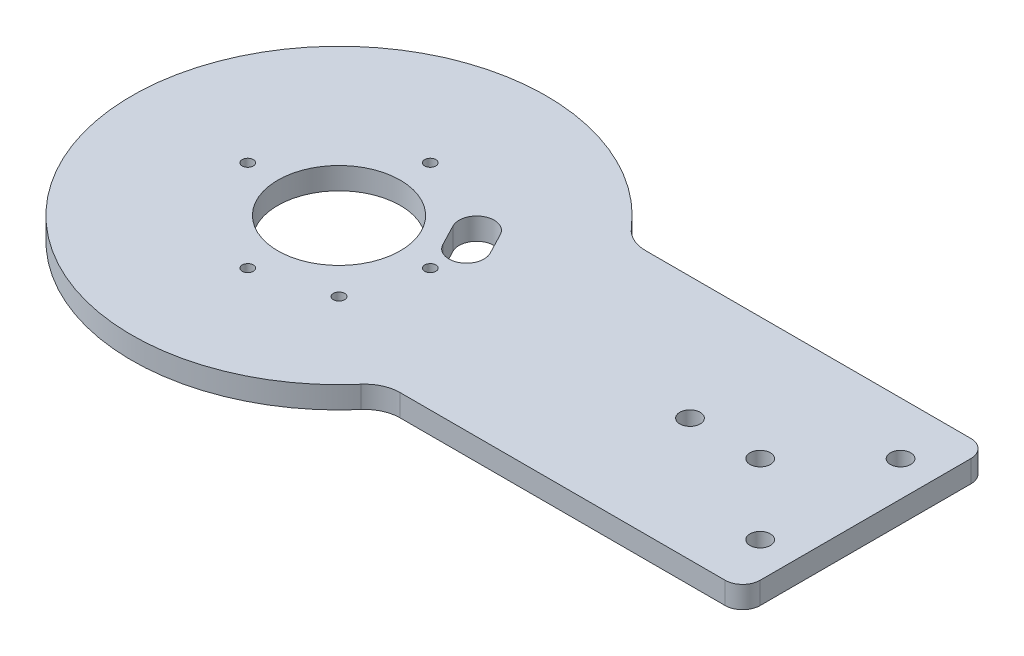
ISO-10303-21;
HEADER;
FILE_DESCRIPTION(('STEP AP214'),'2;1');
FILE_NAME('part.step','',(''),(''),'','','');
FILE_SCHEMA(('AUTOMOTIVE_DESIGN { 1 0 10303 214 1 1 1 1 }'));
ENDSEC;
DATA;
#1=APPLICATION_CONTEXT('core data for automotive mechanical design processes');
#2=APPLICATION_PROTOCOL_DEFINITION('international standard','automotive_design',2000,#1);
#3=PRODUCT_CONTEXT('',#1,'mechanical');
#4=PRODUCT('Part','Part','',(#3));
#5=PRODUCT_RELATED_PRODUCT_CATEGORY('part','',(#4));
#6=PRODUCT_DEFINITION_FORMATION('','',#4);
#7=PRODUCT_DEFINITION_CONTEXT('part definition',#1,'design');
#8=PRODUCT_DEFINITION('design','',#6,#7);
#9=PRODUCT_DEFINITION_SHAPE('','',#8);
#10=(LENGTH_UNIT() NAMED_UNIT(*) SI_UNIT(.MILLI.,.METRE.));
#11=(NAMED_UNIT(*) PLANE_ANGLE_UNIT() SI_UNIT($,.RADIAN.));
#12=(NAMED_UNIT(*) SI_UNIT($,.STERADIAN.) SOLID_ANGLE_UNIT());
#13=UNCERTAINTY_MEASURE_WITH_UNIT(LENGTH_MEASURE(1.E-05),#10,'distance_accuracy_value','');
#14=(GEOMETRIC_REPRESENTATION_CONTEXT(3) GLOBAL_UNCERTAINTY_ASSIGNED_CONTEXT((#13)) GLOBAL_UNIT_ASSIGNED_CONTEXT((#10,
#11,#12)) REPRESENTATION_CONTEXT('',''));
#15=CARTESIAN_POINT('',(0.,0.,0.));
#16=DIRECTION('',(0.,0.,1.));
#17=DIRECTION('',(1.,0.,0.));
#18=AXIS2_PLACEMENT_3D('',#15,#16,#17);
#19=CARTESIAN_POINT('',(0.,7.9375,0.));
#20=DIRECTION('',(0.,-1.,0.));
#21=DIRECTION('',(0.,0.,-1.));
#22=AXIS2_PLACEMENT_3D('',#19,#20,#21);
#23=CYLINDRICAL_SURFACE('',#22,75.00112);
#24=CARTESIAN_POINT('',(0.,7.9375,0.));
#25=DIRECTION('',(0.,1.,0.));
#26=DIRECTION('',(0.,0.,1.));
#27=AXIS2_PLACEMENT_3D('',#24,#25,#26);
#28=CIRCLE('',#27,75.00112);
#29=CARTESIAN_POINT('',(56.8901535536481,7.9375,-48.8741079703429));
#30=VERTEX_POINT('',#29);
#31=CARTESIAN_POINT('',(56.8901535536481,7.9375,48.8741079703429));
#32=VERTEX_POINT('',#31);
#33=EDGE_CURVE('E196',#30,#32,#28,.T.);
#34=ORIENTED_EDGE('',*,*,#33,.F.);
#35=DIRECTION('',(0.,-1.,0.));
#36=VECTOR('',#35,1.);
#37=CARTESIAN_POINT('',(56.8901535536481,7.9375,-48.8741079703429));
#38=LINE('',#37,#36);
#39=CARTESIAN_POINT('',(56.8901535536481,0.,-48.8741079703429));
#40=VERTEX_POINT('',#39);
#41=EDGE_CURVE('E238',#30,#40,#38,.T.);
#42=ORIENTED_EDGE('',*,*,#41,.T.);
#43=CARTESIAN_POINT('',(0.,0.,0.));
#44=DIRECTION('',(0.,1.,0.));
#45=DIRECTION('',(0.,0.,1.));
#46=AXIS2_PLACEMENT_3D('',#43,#44,#45);
#47=CIRCLE('',#46,75.00112);
#48=CARTESIAN_POINT('',(56.8901535536481,0.,48.8741079703429));
#49=VERTEX_POINT('',#48);
#50=EDGE_CURVE('E193',#40,#49,#47,.T.);
#51=ORIENTED_EDGE('',*,*,#50,.T.);
#52=DIRECTION('',(0.,-1.,0.));
#53=VECTOR('',#52,1.);
#54=CARTESIAN_POINT('',(56.8901535536481,7.9375,48.8741079703429));
#55=LINE('',#54,#53);
#56=EDGE_CURVE('E236',#49,#32,#55,.F.);
#57=ORIENTED_EDGE('',*,*,#56,.T.);
#58=EDGE_LOOP('',(#34,#42,#51,#57));
#59=FACE_BOUND('',#58,.T.);
#60=ADVANCED_FACE('F35',(#59),#23,.T.);
#61=CARTESIAN_POINT('',(190.5,7.9375,44.45));
#62=DIRECTION('',(0.,0.,-1.));
#63=DIRECTION('',(-1.,0.,0.));
#64=AXIS2_PLACEMENT_3D('',#61,#62,#63);
#65=PLANE('',#64);
#66=DIRECTION('',(1.,0.,0.));
#67=VECTOR('',#66,1.);
#68=CARTESIAN_POINT('',(190.5,7.9375,44.45));
#69=LINE('',#68,#67);
#70=CARTESIAN_POINT('',(66.5234090321174,7.9375,44.45));
#71=VERTEX_POINT('',#70);
#72=CARTESIAN_POINT('',(184.15,7.9375,44.45));
#73=VERTEX_POINT('',#72);
#74=EDGE_CURVE('E198',#71,#73,#69,.T.);
#75=ORIENTED_EDGE('',*,*,#74,.F.);
#76=DIRECTION('',(0.,1.,0.));
#77=VECTOR('',#76,1.);
#78=CARTESIAN_POINT('',(66.5234090321174,0.,44.45));
#79=LINE('',#78,#77);
#80=CARTESIAN_POINT('',(66.5234090321174,0.,44.45));
#81=VERTEX_POINT('',#80);
#82=EDGE_CURVE('E243',#71,#81,#79,.F.);
#83=ORIENTED_EDGE('',*,*,#82,.T.);
#84=DIRECTION('',(1.,0.,0.));
#85=VECTOR('',#84,1.);
#86=CARTESIAN_POINT('',(190.5,0.,44.45));
#87=LINE('',#86,#85);
#88=CARTESIAN_POINT('',(184.15,0.,44.45));
#89=VERTEX_POINT('',#88);
#90=EDGE_CURVE('E210',#81,#89,#87,.T.);
#91=ORIENTED_EDGE('',*,*,#90,.T.);
#92=DIRECTION('',(0.,-1.,0.));
#93=VECTOR('',#92,1.);
#94=CARTESIAN_POINT('',(184.15,7.9375,44.45));
#95=LINE('',#94,#93);
#96=EDGE_CURVE('E226',#89,#73,#95,.F.);
#97=ORIENTED_EDGE('',*,*,#96,.T.);
#98=EDGE_LOOP('',(#75,#83,#91,#97));
#99=FACE_BOUND('',#98,.T.);
#100=ADVANCED_FACE('F257',(#99),#65,.F.);
#101=CARTESIAN_POINT('',(190.5,7.9375,-44.45));
#102=DIRECTION('',(-1.,0.,0.));
#103=DIRECTION('',(0.,0.,1.));
#104=AXIS2_PLACEMENT_3D('',#101,#102,#103);
#105=PLANE('',#104);
#106=DIRECTION('',(0.,0.,-1.));
#107=VECTOR('',#106,1.);
#108=CARTESIAN_POINT('',(190.5,7.9375,-44.45));
#109=LINE('',#108,#107);
#110=CARTESIAN_POINT('',(190.5,7.9375,38.1));
#111=VERTEX_POINT('',#110);
#112=CARTESIAN_POINT('',(190.5,7.9375,-38.1));
#113=VERTEX_POINT('',#112);
#114=EDGE_CURVE('E201',#111,#113,#109,.T.);
#115=ORIENTED_EDGE('',*,*,#114,.F.);
#116=DIRECTION('',(0.,-1.,0.));
#117=VECTOR('',#116,1.);
#118=CARTESIAN_POINT('',(190.5,7.9375,38.1));
#119=LINE('',#118,#117);
#120=CARTESIAN_POINT('',(190.5,0.,38.1));
#121=VERTEX_POINT('',#120);
#122=EDGE_CURVE('E218',#111,#121,#119,.T.);
#123=ORIENTED_EDGE('',*,*,#122,.T.);
#124=DIRECTION('',(0.,0.,-1.));
#125=VECTOR('',#124,1.);
#126=CARTESIAN_POINT('',(190.5,0.,-44.45));
#127=LINE('',#126,#125);
#128=CARTESIAN_POINT('',(190.5,0.,-38.1));
#129=VERTEX_POINT('',#128);
#130=EDGE_CURVE('E212',#121,#129,#127,.T.);
#131=ORIENTED_EDGE('',*,*,#130,.T.);
#132=DIRECTION('',(0.,-1.,0.));
#133=VECTOR('',#132,1.);
#134=CARTESIAN_POINT('',(190.5,7.9375,-38.1));
#135=LINE('',#134,#133);
#136=EDGE_CURVE('E207',#129,#113,#135,.F.);
#137=ORIENTED_EDGE('',*,*,#136,.T.);
#138=EDGE_LOOP('',(#115,#123,#131,#137));
#139=FACE_BOUND('',#138,.T.);
#140=ADVANCED_FACE('F265',(#139),#105,.F.);
#141=CARTESIAN_POINT('',(190.5,7.9375,-44.45));
#142=DIRECTION('',(0.,0.,1.));
#143=DIRECTION('',(1.,0.,0.));
#144=AXIS2_PLACEMENT_3D('',#141,#142,#143);
#145=PLANE('',#144);
#146=DIRECTION('',(-1.,0.,0.));
#147=VECTOR('',#146,1.);
#148=CARTESIAN_POINT('',(190.5,0.,-44.45));
#149=LINE('',#148,#147);
#150=CARTESIAN_POINT('',(184.15,0.,-44.45));
#151=VERTEX_POINT('',#150);
#152=CARTESIAN_POINT('',(66.5234090321174,0.,-44.45));
#153=VERTEX_POINT('',#152);
#154=EDGE_CURVE('E199',#151,#153,#149,.T.);
#155=ORIENTED_EDGE('',*,*,#154,.T.);
#156=DIRECTION('',(0.,1.,0.));
#157=VECTOR('',#156,1.);
#158=CARTESIAN_POINT('',(66.5234090321174,7.9375,-44.45));
#159=LINE('',#158,#157);
#160=CARTESIAN_POINT('',(66.5234090321174,7.9375,-44.45));
#161=VERTEX_POINT('',#160);
#162=EDGE_CURVE('E241',#153,#161,#159,.T.);
#163=ORIENTED_EDGE('',*,*,#162,.T.);
#164=DIRECTION('',(-1.,0.,0.));
#165=VECTOR('',#164,1.);
#166=CARTESIAN_POINT('',(190.5,7.9375,-44.45));
#167=LINE('',#166,#165);
#168=CARTESIAN_POINT('',(184.15,7.9375,-44.45));
#169=VERTEX_POINT('',#168);
#170=EDGE_CURVE('E204',#169,#161,#167,.T.);
#171=ORIENTED_EDGE('',*,*,#170,.F.);
#172=DIRECTION('',(0.,-1.,0.));
#173=VECTOR('',#172,1.);
#174=CARTESIAN_POINT('',(184.15,7.9375,-44.45));
#175=LINE('',#174,#173);
#176=EDGE_CURVE('E233',#169,#151,#175,.T.);
#177=ORIENTED_EDGE('',*,*,#176,.T.);
#178=EDGE_LOOP('',(#155,#163,#171,#177));
#179=FACE_BOUND('',#178,.T.);
#180=ADVANCED_FACE('F275',(#179),#145,.F.);
#181=CARTESIAN_POINT('',(0.,7.9375,0.));
#182=DIRECTION('',(0.,1.,0.));
#183=DIRECTION('',(0.,0.,1.));
#184=AXIS2_PLACEMENT_3D('',#181,#182,#183);
#185=PLANE('',#184);
#186=CARTESIAN_POINT('',(177.8,7.9375,-25.4));
#187=DIRECTION('',(0.,1.,0.));
#188=DIRECTION('',(0.,0.,1.));
#189=AXIS2_PLACEMENT_3D('',#186,#187,#188);
#190=CIRCLE('',#189,3.68299999999999);
#191=CARTESIAN_POINT('',(177.8,7.9375,-21.717));
#192=VERTEX_POINT('',#191);
#193=EDGE_CURVE('E551',#192,#192,#190,.T.);
#194=ORIENTED_EDGE('',*,*,#193,.F.);
#195=EDGE_LOOP('',(#194));
#196=FACE_BOUND('',#195,.T.);
#197=CARTESIAN_POINT('',(177.8,7.9375,25.4));
#198=DIRECTION('',(0.,1.,0.));
#199=DIRECTION('',(0.,0.,1.));
#200=AXIS2_PLACEMENT_3D('',#197,#198,#199);
#201=CIRCLE('',#200,3.68299999999999);
#202=CARTESIAN_POINT('',(177.8,7.9375,29.083));
#203=VERTEX_POINT('',#202);
#204=EDGE_CURVE('E547',#203,#203,#201,.T.);
#205=ORIENTED_EDGE('',*,*,#204,.F.);
#206=EDGE_LOOP('',(#205));
#207=FACE_BOUND('',#206,.T.);
#208=CARTESIAN_POINT('',(152.4,7.9375,0.));
#209=DIRECTION('',(0.,1.,0.));
#210=DIRECTION('',(0.,0.,1.));
#211=AXIS2_PLACEMENT_3D('',#208,#209,#210);
#212=CIRCLE('',#211,3.68299999999999);
#213=CARTESIAN_POINT('',(152.4,7.9375,3.68299999999999));
#214=VERTEX_POINT('',#213);
#215=EDGE_CURVE('E543',#214,#214,#212,.T.);
#216=ORIENTED_EDGE('',*,*,#215,.F.);
#217=EDGE_LOOP('',(#216));
#218=FACE_BOUND('',#217,.T.);
#219=CARTESIAN_POINT('',(127.,7.9375,0.));
#220=DIRECTION('',(0.,1.,0.));
#221=DIRECTION('',(0.,0.,1.));
#222=AXIS2_PLACEMENT_3D('',#219,#220,#221);
#223=CIRCLE('',#222,3.68299999999999);
#224=CARTESIAN_POINT('',(127.,7.9375,3.68299999999999));
#225=VERTEX_POINT('',#224);
#226=EDGE_CURVE('E539',#225,#225,#223,.T.);
#227=ORIENTED_EDGE('',*,*,#226,.F.);
#228=EDGE_LOOP('',(#227));
#229=FACE_BOUND('',#228,.T.);
#230=CARTESIAN_POINT('',(29.5482747158688,7.9375,-20.2498934643012));
#231=DIRECTION('',(0.,-1.,0.));
#232=DIRECTION('',(0.,0.,-1.));
#233=AXIS2_PLACEMENT_3D('',#230,#231,#232);
#234=CIRCLE('',#233,6.35);
#235=CARTESIAN_POINT('',(23.9157559251871,7.9375,-17.3177897702588));
#236=VERTEX_POINT('',#235);
#237=CARTESIAN_POINT('',(35.1807935065505,7.9375,-23.1819971583436));
#238=VERTEX_POINT('',#237);
#239=EDGE_CURVE('E127',#236,#238,#234,.T.);
#240=ORIENTED_EDGE('',*,*,#239,.T.);
#241=DIRECTION('',(0.461748613235028,0.,0.887010833178225));
#242=VECTOR('',#241,1.);
#243=CARTESIAN_POINT('',(35.1807935065505,7.9375,-23.1819971583436));
#244=LINE('',#243,#242);
#245=CARTESIAN_POINT('',(39.1684545304482,7.9375,-15.5217716030165));
#246=VERTEX_POINT('',#245);
#247=EDGE_CURVE('E139',#238,#246,#244,.T.);
#248=ORIENTED_EDGE('',*,*,#247,.T.);
#249=CARTESIAN_POINT('',(33.5359357397665,7.9375,-12.589667908974));
#250=DIRECTION('',(0.,-1.,0.));
#251=DIRECTION('',(0.,0.,-1.));
#252=AXIS2_PLACEMENT_3D('',#249,#250,#251);
#253=CIRCLE('',#252,6.35);
#254=CARTESIAN_POINT('',(27.9034169490848,7.9375,-9.65756421493162));
#255=VERTEX_POINT('',#254);
#256=EDGE_CURVE('E143',#246,#255,#253,.T.);
#257=ORIENTED_EDGE('',*,*,#256,.T.);
#258=DIRECTION('',(-0.461748613235028,0.,-0.887010833178225));
#259=VECTOR('',#258,1.);
#260=CARTESIAN_POINT('',(23.9157559251871,7.9375,-17.3177897702588));
#261=LINE('',#260,#259);
#262=EDGE_CURVE('E135',#255,#236,#261,.T.);
#263=ORIENTED_EDGE('',*,*,#262,.T.);
#264=EDGE_LOOP('',(#240,#248,#257,#263));
#265=FACE_BOUND('',#264,.T.);
#266=CARTESIAN_POINT('',(25.4,7.9375,25.4));
#267=DIRECTION('',(0.,-1.,0.));
#268=DIRECTION('',(0.,0.,-1.));
#269=AXIS2_PLACEMENT_3D('',#266,#267,#268);
#270=CIRCLE('',#269,2.0193);
#271=CARTESIAN_POINT('',(25.4,7.9375,23.3807));
#272=VERTEX_POINT('',#271);
#273=EDGE_CURVE('E532',#272,#272,#270,.T.);
#274=ORIENTED_EDGE('',*,*,#273,.T.);
#275=EDGE_LOOP('',(#274));
#276=FACE_BOUND('',#275,.T.);
#277=CARTESIAN_POINT('',(-33.02,7.9375,0.));
#278=DIRECTION('',(0.,-1.,0.));
#279=DIRECTION('',(0.,0.,-1.));
#280=AXIS2_PLACEMENT_3D('',#277,#278,#279);
#281=CIRCLE('',#280,2.0193);
#282=CARTESIAN_POINT('',(-33.02,7.9375,-2.0193));
#283=VERTEX_POINT('',#282);
#284=EDGE_CURVE('E189',#283,#283,#281,.T.);
#285=ORIENTED_EDGE('',*,*,#284,.T.);
#286=EDGE_LOOP('',(#285));
#287=FACE_BOUND('',#286,.T.);
#288=CARTESIAN_POINT('',(0.,7.9375,-33.02));
#289=DIRECTION('',(0.,-1.,0.));
#290=DIRECTION('',(0.,0.,-1.));
#291=AXIS2_PLACEMENT_3D('',#288,#289,#290);
#292=CIRCLE('',#291,2.0193);
#293=CARTESIAN_POINT('',(0.,7.9375,-35.0393));
#294=VERTEX_POINT('',#293);
#295=EDGE_CURVE('E183',#294,#294,#292,.T.);
#296=ORIENTED_EDGE('',*,*,#295,.T.);
#297=EDGE_LOOP('',(#296));
#298=FACE_BOUND('',#297,.T.);
#299=CARTESIAN_POINT('',(33.02,7.9375,0.));
#300=DIRECTION('',(0.,-1.,0.));
#301=DIRECTION('',(0.,0.,-1.));
#302=AXIS2_PLACEMENT_3D('',#299,#300,#301);
#303=CIRCLE('',#302,2.0193);
#304=CARTESIAN_POINT('',(33.02,7.9375,-2.0193));
#305=VERTEX_POINT('',#304);
#306=EDGE_CURVE('E177',#305,#305,#303,.T.);
#307=ORIENTED_EDGE('',*,*,#306,.T.);
#308=EDGE_LOOP('',(#307));
#309=FACE_BOUND('',#308,.T.);
#310=CARTESIAN_POINT('',(0.,7.9375,33.02));
#311=DIRECTION('',(0.,-1.,0.));
#312=DIRECTION('',(0.,0.,-1.));
#313=AXIS2_PLACEMENT_3D('',#310,#311,#312);
#314=CIRCLE('',#313,2.0193);
#315=CARTESIAN_POINT('',(0.,7.9375,31.0007));
#316=VERTEX_POINT('',#315);
#317=EDGE_CURVE('E170',#316,#316,#314,.T.);
#318=ORIENTED_EDGE('',*,*,#317,.T.);
#319=EDGE_LOOP('',(#318));
#320=FACE_BOUND('',#319,.T.);
#321=CARTESIAN_POINT('',(0.,7.9375,0.));
#322=DIRECTION('',(0.,-1.,0.));
#323=DIRECTION('',(0.,0.,-1.));
#324=AXIS2_PLACEMENT_3D('',#321,#322,#323);
#325=CIRCLE('',#324,22.1615);
#326=CARTESIAN_POINT('',(0.,7.9375,-22.1615));
#327=VERTEX_POINT('',#326);
#328=EDGE_CURVE('E190',#327,#327,#325,.T.);
#329=ORIENTED_EDGE('',*,*,#328,.T.);
#330=EDGE_LOOP('',(#329));
#331=FACE_BOUND('',#330,.T.);
#332=ORIENTED_EDGE('',*,*,#33,.T.);
#333=CARTESIAN_POINT('',(66.5234090321174,7.9375,57.15));
#334=DIRECTION('',(0.,1.,0.));
#335=DIRECTION('',(0.,0.,1.));
#336=AXIS2_PLACEMENT_3D('',#333,#334,#335);
#337=CIRCLE('',#336,12.7);
#338=EDGE_CURVE('E11',#32,#71,#337,.F.);
#339=ORIENTED_EDGE('',*,*,#338,.T.);
#340=ORIENTED_EDGE('',*,*,#74,.T.);
#341=CARTESIAN_POINT('',(184.15,7.9375,38.1));
#342=DIRECTION('',(0.,1.,0.));
#343=DIRECTION('',(0.,0.,1.));
#344=AXIS2_PLACEMENT_3D('',#341,#342,#343);
#345=CIRCLE('',#344,6.35);
#346=EDGE_CURVE('E231',#73,#111,#345,.T.);
#347=ORIENTED_EDGE('',*,*,#346,.T.);
#348=ORIENTED_EDGE('',*,*,#114,.T.);
#349=CARTESIAN_POINT('',(184.15,7.9375,-38.1));
#350=DIRECTION('',(0.,1.,0.));
#351=DIRECTION('',(0.,0.,1.));
#352=AXIS2_PLACEMENT_3D('',#349,#350,#351);
#353=CIRCLE('',#352,6.35);
#354=EDGE_CURVE('E229',#113,#169,#353,.T.);
#355=ORIENTED_EDGE('',*,*,#354,.T.);
#356=ORIENTED_EDGE('',*,*,#170,.T.);
#357=CARTESIAN_POINT('',(66.5234090321174,7.9375,-57.15));
#358=DIRECTION('',(0.,1.,0.));
#359=DIRECTION('',(0.,0.,1.));
#360=AXIS2_PLACEMENT_3D('',#357,#358,#359);
#361=CIRCLE('',#360,12.7);
#362=EDGE_CURVE('E247',#161,#30,#361,.F.);
#363=ORIENTED_EDGE('',*,*,#362,.T.);
#364=EDGE_LOOP('',(#332,#339,#340,#347,#348,#355,#356,#363));
#365=FACE_BOUND('',#364,.T.);
#366=ADVANCED_FACE('F145',(#196,#207,#218,#229,#265,#276,#287,#298,#309,#320,#331,#365),#185,.T.);
#367=CARTESIAN_POINT('',(0.,0.,0.));
#368=DIRECTION('',(0.,1.,0.));
#369=DIRECTION('',(0.,0.,1.));
#370=AXIS2_PLACEMENT_3D('',#367,#368,#369);
#371=PLANE('',#370);
#372=CARTESIAN_POINT('',(177.8,0.,-25.4));
#373=DIRECTION('',(0.,1.,0.));
#374=DIRECTION('',(0.,0.,1.));
#375=AXIS2_PLACEMENT_3D('',#372,#373,#374);
#376=CIRCLE('',#375,3.68299999999999);
#377=CARTESIAN_POINT('',(177.8,0.,-21.717));
#378=VERTEX_POINT('',#377);
#379=EDGE_CURVE('E499',#378,#378,#376,.T.);
#380=ORIENTED_EDGE('',*,*,#379,.T.);
#381=EDGE_LOOP('',(#380));
#382=FACE_BOUND('',#381,.T.);
#383=CARTESIAN_POINT('',(177.8,0.,25.4));
#384=DIRECTION('',(0.,1.,0.));
#385=DIRECTION('',(0.,0.,1.));
#386=AXIS2_PLACEMENT_3D('',#383,#384,#385);
#387=CIRCLE('',#386,3.68299999999999);
#388=CARTESIAN_POINT('',(177.8,0.,29.083));
#389=VERTEX_POINT('',#388);
#390=EDGE_CURVE('E503',#389,#389,#387,.T.);
#391=ORIENTED_EDGE('',*,*,#390,.T.);
#392=EDGE_LOOP('',(#391));
#393=FACE_BOUND('',#392,.T.);
#394=CARTESIAN_POINT('',(152.4,0.,0.));
#395=DIRECTION('',(0.,1.,0.));
#396=DIRECTION('',(0.,0.,1.));
#397=AXIS2_PLACEMENT_3D('',#394,#395,#396);
#398=CIRCLE('',#397,3.68299999999999);
#399=CARTESIAN_POINT('',(152.4,0.,3.68299999999999));
#400=VERTEX_POINT('',#399);
#401=EDGE_CURVE('E507',#400,#400,#398,.T.);
#402=ORIENTED_EDGE('',*,*,#401,.T.);
#403=EDGE_LOOP('',(#402));
#404=FACE_BOUND('',#403,.T.);
#405=CARTESIAN_POINT('',(127.,0.,0.));
#406=DIRECTION('',(0.,1.,0.));
#407=DIRECTION('',(0.,0.,1.));
#408=AXIS2_PLACEMENT_3D('',#405,#406,#407);
#409=CIRCLE('',#408,3.68299999999999);
#410=CARTESIAN_POINT('',(127.,0.,3.68299999999999));
#411=VERTEX_POINT('',#410);
#412=EDGE_CURVE('E161',#411,#411,#409,.T.);
#413=ORIENTED_EDGE('',*,*,#412,.T.);
#414=EDGE_LOOP('',(#413));
#415=FACE_BOUND('',#414,.T.);
#416=DIRECTION('',(0.461748613235028,0.,0.887010833178225));
#417=VECTOR('',#416,1.);
#418=CARTESIAN_POINT('',(35.1807935065505,0.,-23.1819971583436));
#419=LINE('',#418,#417);
#420=CARTESIAN_POINT('',(35.1807935065505,0.,-23.1819971583436));
#421=VERTEX_POINT('',#420);
#422=CARTESIAN_POINT('',(39.1684545304482,0.,-15.5217716030165));
#423=VERTEX_POINT('',#422);
#424=EDGE_CURVE('E160',#421,#423,#419,.T.);
#425=ORIENTED_EDGE('',*,*,#424,.F.);
#426=CARTESIAN_POINT('',(29.5482747158688,0.,-20.2498934643012));
#427=DIRECTION('',(0.,-1.,0.));
#428=DIRECTION('',(0.,0.,-1.));
#429=AXIS2_PLACEMENT_3D('',#426,#427,#428);
#430=CIRCLE('',#429,6.35);
#431=CARTESIAN_POINT('',(23.9157559251871,0.,-17.3177897702588));
#432=VERTEX_POINT('',#431);
#433=EDGE_CURVE('E130',#432,#421,#430,.T.);
#434=ORIENTED_EDGE('',*,*,#433,.F.);
#435=DIRECTION('',(-0.461748613235028,0.,-0.887010833178225));
#436=VECTOR('',#435,1.);
#437=CARTESIAN_POINT('',(23.9157559251871,0.,-17.3177897702588));
#438=LINE('',#437,#436);
#439=CARTESIAN_POINT('',(27.9034169490848,0.,-9.65756421493162));
#440=VERTEX_POINT('',#439);
#441=EDGE_CURVE('E148',#440,#432,#438,.T.);
#442=ORIENTED_EDGE('',*,*,#441,.F.);
#443=CARTESIAN_POINT('',(33.5359357397665,0.,-12.589667908974));
#444=DIRECTION('',(0.,-1.,0.));
#445=DIRECTION('',(0.,0.,-1.));
#446=AXIS2_PLACEMENT_3D('',#443,#444,#445);
#447=CIRCLE('',#446,6.35);
#448=EDGE_CURVE('E151',#423,#440,#447,.T.);
#449=ORIENTED_EDGE('',*,*,#448,.F.);
#450=EDGE_LOOP('',(#425,#434,#442,#449));
#451=FACE_BOUND('',#450,.T.);
#452=CARTESIAN_POINT('',(25.4,0.,25.4));
#453=DIRECTION('',(0.,-1.,0.));
#454=DIRECTION('',(0.,0.,-1.));
#455=AXIS2_PLACEMENT_3D('',#452,#453,#454);
#456=CIRCLE('',#455,2.0193);
#457=CARTESIAN_POINT('',(25.4,0.,23.3807));
#458=VERTEX_POINT('',#457);
#459=EDGE_CURVE('E154',#458,#458,#456,.T.);
#460=ORIENTED_EDGE('',*,*,#459,.F.);
#461=EDGE_LOOP('',(#460));
#462=FACE_BOUND('',#461,.T.);
#463=CARTESIAN_POINT('',(-33.02,0.,0.));
#464=DIRECTION('',(0.,-1.,0.));
#465=DIRECTION('',(0.,0.,-1.));
#466=AXIS2_PLACEMENT_3D('',#463,#464,#465);
#467=CIRCLE('',#466,2.0193);
#468=CARTESIAN_POINT('',(-33.02,0.,-2.0193));
#469=VERTEX_POINT('',#468);
#470=EDGE_CURVE('E519',#469,#469,#467,.T.);
#471=ORIENTED_EDGE('',*,*,#470,.F.);
#472=EDGE_LOOP('',(#471));
#473=FACE_BOUND('',#472,.T.);
#474=CARTESIAN_POINT('',(0.,0.,-33.02));
#475=DIRECTION('',(0.,-1.,0.));
#476=DIRECTION('',(0.,0.,-1.));
#477=AXIS2_PLACEMENT_3D('',#474,#475,#476);
#478=CIRCLE('',#477,2.0193);
#479=CARTESIAN_POINT('',(0.,0.,-35.0393));
#480=VERTEX_POINT('',#479);
#481=EDGE_CURVE('E186',#480,#480,#478,.T.);
#482=ORIENTED_EDGE('',*,*,#481,.F.);
#483=EDGE_LOOP('',(#482));
#484=FACE_BOUND('',#483,.T.);
#485=CARTESIAN_POINT('',(33.02,0.,0.));
#486=DIRECTION('',(0.,-1.,0.));
#487=DIRECTION('',(0.,0.,-1.));
#488=AXIS2_PLACEMENT_3D('',#485,#486,#487);
#489=CIRCLE('',#488,2.0193);
#490=CARTESIAN_POINT('',(33.02,0.,-2.0193));
#491=VERTEX_POINT('',#490);
#492=EDGE_CURVE('E180',#491,#491,#489,.T.);
#493=ORIENTED_EDGE('',*,*,#492,.F.);
#494=EDGE_LOOP('',(#493));
#495=FACE_BOUND('',#494,.T.);
#496=CARTESIAN_POINT('',(0.,0.,33.02));
#497=DIRECTION('',(0.,-1.,0.));
#498=DIRECTION('',(0.,0.,-1.));
#499=AXIS2_PLACEMENT_3D('',#496,#497,#498);
#500=CIRCLE('',#499,2.0193);
#501=CARTESIAN_POINT('',(0.,0.,31.0007));
#502=VERTEX_POINT('',#501);
#503=EDGE_CURVE('E174',#502,#502,#500,.T.);
#504=ORIENTED_EDGE('',*,*,#503,.F.);
#505=EDGE_LOOP('',(#504));
#506=FACE_BOUND('',#505,.T.);
#507=CARTESIAN_POINT('',(0.,0.,0.));
#508=DIRECTION('',(0.,-1.,0.));
#509=DIRECTION('',(0.,0.,-1.));
#510=AXIS2_PLACEMENT_3D('',#507,#508,#509);
#511=CIRCLE('',#510,22.1615);
#512=CARTESIAN_POINT('',(0.,0.,-22.1615));
#513=VERTEX_POINT('',#512);
#514=EDGE_CURVE('E173',#513,#513,#511,.T.);
#515=ORIENTED_EDGE('',*,*,#514,.F.);
#516=EDGE_LOOP('',(#515));
#517=FACE_BOUND('',#516,.T.);
#518=ORIENTED_EDGE('',*,*,#130,.F.);
#519=CARTESIAN_POINT('',(184.15,0.,38.1));
#520=DIRECTION('',(0.,1.,0.));
#521=DIRECTION('',(0.,0.,1.));
#522=AXIS2_PLACEMENT_3D('',#519,#520,#521);
#523=CIRCLE('',#522,6.35);
#524=EDGE_CURVE('E223',#121,#89,#523,.F.);
#525=ORIENTED_EDGE('',*,*,#524,.T.);
#526=ORIENTED_EDGE('',*,*,#90,.F.);
#527=CARTESIAN_POINT('',(66.5234090321174,0.,57.15));
#528=DIRECTION('',(0.,1.,0.));
#529=DIRECTION('',(0.,0.,1.));
#530=AXIS2_PLACEMENT_3D('',#527,#528,#529);
#531=CIRCLE('',#530,12.7);
#532=EDGE_CURVE('E43',#81,#49,#531,.T.);
#533=ORIENTED_EDGE('',*,*,#532,.T.);
#534=ORIENTED_EDGE('',*,*,#50,.F.);
#535=CARTESIAN_POINT('',(66.5234090321174,0.,-57.15));
#536=DIRECTION('',(0.,1.,0.));
#537=DIRECTION('',(0.,0.,1.));
#538=AXIS2_PLACEMENT_3D('',#535,#536,#537);
#539=CIRCLE('',#538,12.7);
#540=EDGE_CURVE('E245',#40,#153,#539,.T.);
#541=ORIENTED_EDGE('',*,*,#540,.T.);
#542=ORIENTED_EDGE('',*,*,#154,.F.);
#543=CARTESIAN_POINT('',(184.15,0.,-38.1));
#544=DIRECTION('',(0.,1.,0.));
#545=DIRECTION('',(0.,0.,1.));
#546=AXIS2_PLACEMENT_3D('',#543,#544,#545);
#547=CIRCLE('',#546,6.35);
#548=EDGE_CURVE('E221',#151,#129,#547,.F.);
#549=ORIENTED_EDGE('',*,*,#548,.T.);
#550=EDGE_LOOP('',(#518,#525,#526,#533,#534,#541,#542,#549));
#551=FACE_BOUND('',#550,.T.);
#552=ADVANCED_FACE('F252',(#382,#393,#404,#415,#451,#462,#473,#484,#495,#506,#517,#551),#371,.F.);
#553=CARTESIAN_POINT('',(0.,7.9375,0.));
#554=DIRECTION('',(0.,-1.,0.));
#555=DIRECTION('',(0.,0.,-1.));
#556=AXIS2_PLACEMENT_3D('',#553,#554,#555);
#557=CYLINDRICAL_SURFACE('',#556,22.1615);
#558=ORIENTED_EDGE('',*,*,#328,.F.);
#559=EDGE_LOOP('',(#558));
#560=FACE_BOUND('',#559,.T.);
#561=ORIENTED_EDGE('',*,*,#514,.T.);
#562=EDGE_LOOP('',(#561));
#563=FACE_BOUND('',#562,.T.);
#564=ADVANCED_FACE('F342',(#560,#563),#557,.F.);
#565=CARTESIAN_POINT('',(0.,7.9375,33.02));
#566=DIRECTION('',(0.,-1.,0.));
#567=DIRECTION('',(0.,0.,-1.));
#568=AXIS2_PLACEMENT_3D('',#565,#566,#567);
#569=CYLINDRICAL_SURFACE('',#568,2.0193);
#570=ORIENTED_EDGE('',*,*,#317,.F.);
#571=EDGE_LOOP('',(#570));
#572=FACE_BOUND('',#571,.T.);
#573=ORIENTED_EDGE('',*,*,#503,.T.);
#574=EDGE_LOOP('',(#573));
#575=FACE_BOUND('',#574,.T.);
#576=ADVANCED_FACE('F338',(#572,#575),#569,.F.);
#577=CARTESIAN_POINT('',(33.02,7.9375,0.));
#578=DIRECTION('',(0.,-1.,0.));
#579=DIRECTION('',(0.,0.,-1.));
#580=AXIS2_PLACEMENT_3D('',#577,#578,#579);
#581=CYLINDRICAL_SURFACE('',#580,2.0193);
#582=ORIENTED_EDGE('',*,*,#306,.F.);
#583=EDGE_LOOP('',(#582));
#584=FACE_BOUND('',#583,.T.);
#585=ORIENTED_EDGE('',*,*,#492,.T.);
#586=EDGE_LOOP('',(#585));
#587=FACE_BOUND('',#586,.T.);
#588=ADVANCED_FACE('F341',(#584,#587),#581,.F.);
#589=CARTESIAN_POINT('',(0.,7.9375,-33.02));
#590=DIRECTION('',(0.,-1.,0.));
#591=DIRECTION('',(0.,0.,-1.));
#592=AXIS2_PLACEMENT_3D('',#589,#590,#591);
#593=CYLINDRICAL_SURFACE('',#592,2.0193);
#594=ORIENTED_EDGE('',*,*,#295,.F.);
#595=EDGE_LOOP('',(#594));
#596=FACE_BOUND('',#595,.T.);
#597=ORIENTED_EDGE('',*,*,#481,.T.);
#598=EDGE_LOOP('',(#597));
#599=FACE_BOUND('',#598,.T.);
#600=ADVANCED_FACE('F321',(#596,#599),#593,.F.);
#601=CARTESIAN_POINT('',(-33.02,7.9375,0.));
#602=DIRECTION('',(0.,-1.,0.));
#603=DIRECTION('',(0.,0.,-1.));
#604=AXIS2_PLACEMENT_3D('',#601,#602,#603);
#605=CYLINDRICAL_SURFACE('',#604,2.0193);
#606=ORIENTED_EDGE('',*,*,#284,.F.);
#607=EDGE_LOOP('',(#606));
#608=FACE_BOUND('',#607,.T.);
#609=ORIENTED_EDGE('',*,*,#470,.T.);
#610=EDGE_LOOP('',(#609));
#611=FACE_BOUND('',#610,.T.);
#612=ADVANCED_FACE('F317',(#608,#611),#605,.F.);
#613=CARTESIAN_POINT('',(25.4,7.9375,25.4));
#614=DIRECTION('',(0.,-1.,0.));
#615=DIRECTION('',(0.,0.,-1.));
#616=AXIS2_PLACEMENT_3D('',#613,#614,#615);
#617=CYLINDRICAL_SURFACE('',#616,2.0193);
#618=ORIENTED_EDGE('',*,*,#273,.F.);
#619=EDGE_LOOP('',(#618));
#620=FACE_BOUND('',#619,.T.);
#621=ORIENTED_EDGE('',*,*,#459,.T.);
#622=EDGE_LOOP('',(#621));
#623=FACE_BOUND('',#622,.T.);
#624=ADVANCED_FACE('F320',(#620,#623),#617,.F.);
#625=CARTESIAN_POINT('',(29.5482747158688,7.9375,-20.2498934643012));
#626=DIRECTION('',(0.,-1.,0.));
#627=DIRECTION('',(0.,0.,-1.));
#628=AXIS2_PLACEMENT_3D('',#625,#626,#627);
#629=CYLINDRICAL_SURFACE('',#628,6.35);
#630=ORIENTED_EDGE('',*,*,#433,.T.);
#631=DIRECTION('',(0.,-1.,0.));
#632=VECTOR('',#631,1.);
#633=CARTESIAN_POINT('',(35.1807935065505,7.9375,-23.1819971583436));
#634=LINE('',#633,#632);
#635=EDGE_CURVE('E123',#238,#421,#634,.T.);
#636=ORIENTED_EDGE('',*,*,#635,.F.);
#637=ORIENTED_EDGE('',*,*,#239,.F.);
#638=DIRECTION('',(0.,-1.,0.));
#639=VECTOR('',#638,1.);
#640=CARTESIAN_POINT('',(23.9157559251871,7.9375,-17.3177897702588));
#641=LINE('',#640,#639);
#642=EDGE_CURVE('E165',#236,#432,#641,.T.);
#643=ORIENTED_EDGE('',*,*,#642,.T.);
#644=EDGE_LOOP('',(#630,#636,#637,#643));
#645=FACE_BOUND('',#644,.T.);
#646=ADVANCED_FACE('F125',(#645),#629,.F.);
#647=CARTESIAN_POINT('',(23.9157559251871,7.9375,-17.3177897702588));
#648=DIRECTION('',(-0.887010833178225,0.,0.461748613235028));
#649=DIRECTION('',(0.461748613235028,0.,0.887010833178225));
#650=AXIS2_PLACEMENT_3D('',#647,#648,#649);
#651=PLANE('',#650);
#652=ORIENTED_EDGE('',*,*,#441,.T.);
#653=ORIENTED_EDGE('',*,*,#642,.F.);
#654=ORIENTED_EDGE('',*,*,#262,.F.);
#655=DIRECTION('',(0.,-1.,0.));
#656=VECTOR('',#655,1.);
#657=CARTESIAN_POINT('',(27.9034169490848,7.9375,-9.65756421493162));
#658=LINE('',#657,#656);
#659=EDGE_CURVE('E167',#255,#440,#658,.T.);
#660=ORIENTED_EDGE('',*,*,#659,.T.);
#661=EDGE_LOOP('',(#652,#653,#654,#660));
#662=FACE_BOUND('',#661,.T.);
#663=ADVANCED_FACE('F326',(#662),#651,.F.);
#664=CARTESIAN_POINT('',(33.5359357397665,7.9375,-12.589667908974));
#665=DIRECTION('',(0.,-1.,0.));
#666=DIRECTION('',(0.,0.,-1.));
#667=AXIS2_PLACEMENT_3D('',#664,#665,#666);
#668=CYLINDRICAL_SURFACE('',#667,6.35);
#669=ORIENTED_EDGE('',*,*,#448,.T.);
#670=ORIENTED_EDGE('',*,*,#659,.F.);
#671=ORIENTED_EDGE('',*,*,#256,.F.);
#672=DIRECTION('',(0.,-1.,0.));
#673=VECTOR('',#672,1.);
#674=CARTESIAN_POINT('',(39.1684545304482,7.9375,-15.5217716030165));
#675=LINE('',#674,#673);
#676=EDGE_CURVE('E134',#246,#423,#675,.T.);
#677=ORIENTED_EDGE('',*,*,#676,.T.);
#678=EDGE_LOOP('',(#669,#670,#671,#677));
#679=FACE_BOUND('',#678,.T.);
#680=ADVANCED_FACE('F329',(#679),#668,.F.);
#681=CARTESIAN_POINT('',(35.1807935065505,7.9375,-23.1819971583436));
#682=DIRECTION('',(0.887010833178224,0.,-0.461748613235028));
#683=DIRECTION('',(-0.461748613235029,0.,-0.887010833178225));
#684=AXIS2_PLACEMENT_3D('',#681,#682,#683);
#685=PLANE('',#684);
#686=ORIENTED_EDGE('',*,*,#424,.T.);
#687=ORIENTED_EDGE('',*,*,#676,.F.);
#688=ORIENTED_EDGE('',*,*,#247,.F.);
#689=ORIENTED_EDGE('',*,*,#635,.T.);
#690=EDGE_LOOP('',(#686,#687,#688,#689));
#691=FACE_BOUND('',#690,.T.);
#692=ADVANCED_FACE('F140',(#691),#685,.F.);
#693=CARTESIAN_POINT('',(127.,7.9375,0.));
#694=DIRECTION('',(0.,1.,0.));
#695=DIRECTION('',(0.,0.,1.));
#696=AXIS2_PLACEMENT_3D('',#693,#694,#695);
#697=CYLINDRICAL_SURFACE('',#696,3.68299999999999);
#698=ORIENTED_EDGE('',*,*,#412,.F.);
#699=EDGE_LOOP('',(#698));
#700=FACE_BOUND('',#699,.T.);
#701=ORIENTED_EDGE('',*,*,#226,.T.);
#702=EDGE_LOOP('',(#701));
#703=FACE_BOUND('',#702,.T.);
#704=ADVANCED_FACE('F312',(#700,#703),#697,.F.);
#705=CARTESIAN_POINT('',(152.4,7.9375,0.));
#706=DIRECTION('',(0.,1.,0.));
#707=DIRECTION('',(0.,0.,1.));
#708=AXIS2_PLACEMENT_3D('',#705,#706,#707);
#709=CYLINDRICAL_SURFACE('',#708,3.68299999999999);
#710=ORIENTED_EDGE('',*,*,#401,.F.);
#711=EDGE_LOOP('',(#710));
#712=FACE_BOUND('',#711,.T.);
#713=ORIENTED_EDGE('',*,*,#215,.T.);
#714=EDGE_LOOP('',(#713));
#715=FACE_BOUND('',#714,.T.);
#716=ADVANCED_FACE('F304',(#712,#715),#709,.F.);
#717=CARTESIAN_POINT('',(177.8,7.9375,25.4));
#718=DIRECTION('',(0.,1.,0.));
#719=DIRECTION('',(0.,0.,1.));
#720=AXIS2_PLACEMENT_3D('',#717,#718,#719);
#721=CYLINDRICAL_SURFACE('',#720,3.68299999999999);
#722=ORIENTED_EDGE('',*,*,#390,.F.);
#723=EDGE_LOOP('',(#722));
#724=FACE_BOUND('',#723,.T.);
#725=ORIENTED_EDGE('',*,*,#204,.T.);
#726=EDGE_LOOP('',(#725));
#727=FACE_BOUND('',#726,.T.);
#728=ADVANCED_FACE('F298',(#724,#727),#721,.F.);
#729=CARTESIAN_POINT('',(177.8,7.9375,-25.4));
#730=DIRECTION('',(0.,1.,0.));
#731=DIRECTION('',(0.,0.,1.));
#732=AXIS2_PLACEMENT_3D('',#729,#730,#731);
#733=CYLINDRICAL_SURFACE('',#732,3.68299999999999);
#734=ORIENTED_EDGE('',*,*,#379,.F.);
#735=EDGE_LOOP('',(#734));
#736=FACE_BOUND('',#735,.T.);
#737=ORIENTED_EDGE('',*,*,#193,.T.);
#738=EDGE_LOOP('',(#737));
#739=FACE_BOUND('',#738,.T.);
#740=ADVANCED_FACE('F294',(#736,#739),#733,.F.);
#741=CARTESIAN_POINT('',(184.15,7.9375,38.1));
#742=DIRECTION('',(0.,-1.,0.));
#743=DIRECTION('',(0.,0.,-1.));
#744=AXIS2_PLACEMENT_3D('',#741,#742,#743);
#745=CYLINDRICAL_SURFACE('',#744,6.35);
#746=ORIENTED_EDGE('',*,*,#346,.F.);
#747=ORIENTED_EDGE('',*,*,#96,.F.);
#748=ORIENTED_EDGE('',*,*,#524,.F.);
#749=ORIENTED_EDGE('',*,*,#122,.F.);
#750=EDGE_LOOP('',(#746,#747,#748,#749));
#751=FACE_BOUND('',#750,.T.);
#752=ADVANCED_FACE('F267',(#751),#745,.T.);
#753=CARTESIAN_POINT('',(184.15,7.9375,-38.1));
#754=DIRECTION('',(0.,-1.,0.));
#755=DIRECTION('',(0.,0.,-1.));
#756=AXIS2_PLACEMENT_3D('',#753,#754,#755);
#757=CYLINDRICAL_SURFACE('',#756,6.35);
#758=ORIENTED_EDGE('',*,*,#354,.F.);
#759=ORIENTED_EDGE('',*,*,#136,.F.);
#760=ORIENTED_EDGE('',*,*,#548,.F.);
#761=ORIENTED_EDGE('',*,*,#176,.F.);
#762=EDGE_LOOP('',(#758,#759,#760,#761));
#763=FACE_BOUND('',#762,.T.);
#764=ADVANCED_FACE('F270',(#763),#757,.T.);
#765=CARTESIAN_POINT('',(66.5234090321174,7.9375,-57.15));
#766=DIRECTION('',(0.,-1.,0.));
#767=DIRECTION('',(0.,0.,-1.));
#768=AXIS2_PLACEMENT_3D('',#765,#766,#767);
#769=CYLINDRICAL_SURFACE('',#768,12.7);
#770=ORIENTED_EDGE('',*,*,#362,.F.);
#771=ORIENTED_EDGE('',*,*,#162,.F.);
#772=ORIENTED_EDGE('',*,*,#540,.F.);
#773=ORIENTED_EDGE('',*,*,#41,.F.);
#774=EDGE_LOOP('',(#770,#771,#772,#773));
#775=FACE_BOUND('',#774,.T.);
#776=ADVANCED_FACE('F278',(#775),#769,.F.);
#777=CARTESIAN_POINT('',(66.5234090321174,7.9375,57.15));
#778=DIRECTION('',(0.,-1.,0.));
#779=DIRECTION('',(0.,0.,-1.));
#780=AXIS2_PLACEMENT_3D('',#777,#778,#779);
#781=CYLINDRICAL_SURFACE('',#780,12.7);
#782=ORIENTED_EDGE('',*,*,#338,.F.);
#783=ORIENTED_EDGE('',*,*,#56,.F.);
#784=ORIENTED_EDGE('',*,*,#532,.F.);
#785=ORIENTED_EDGE('',*,*,#82,.F.);
#786=EDGE_LOOP('',(#782,#783,#784,#785));
#787=FACE_BOUND('',#786,.T.);
#788=ADVANCED_FACE('F37',(#787),#781,.F.);
#789=CLOSED_SHELL('',(#60,#100,#140,#180,#366,#552,#564,#576,#588,#600,#612,#624,#646,#663,#680,
#692,#704,#716,#728,#740,#752,#764,#776,#788));
#790=MANIFOLD_SOLID_BREP('B2',#789);
#791=ADVANCED_BREP_SHAPE_REPRESENTATION('',(#18,#790),#14);
#792=SHAPE_DEFINITION_REPRESENTATION(#9,#791);
ENDSEC;
END-ISO-10303-21;
